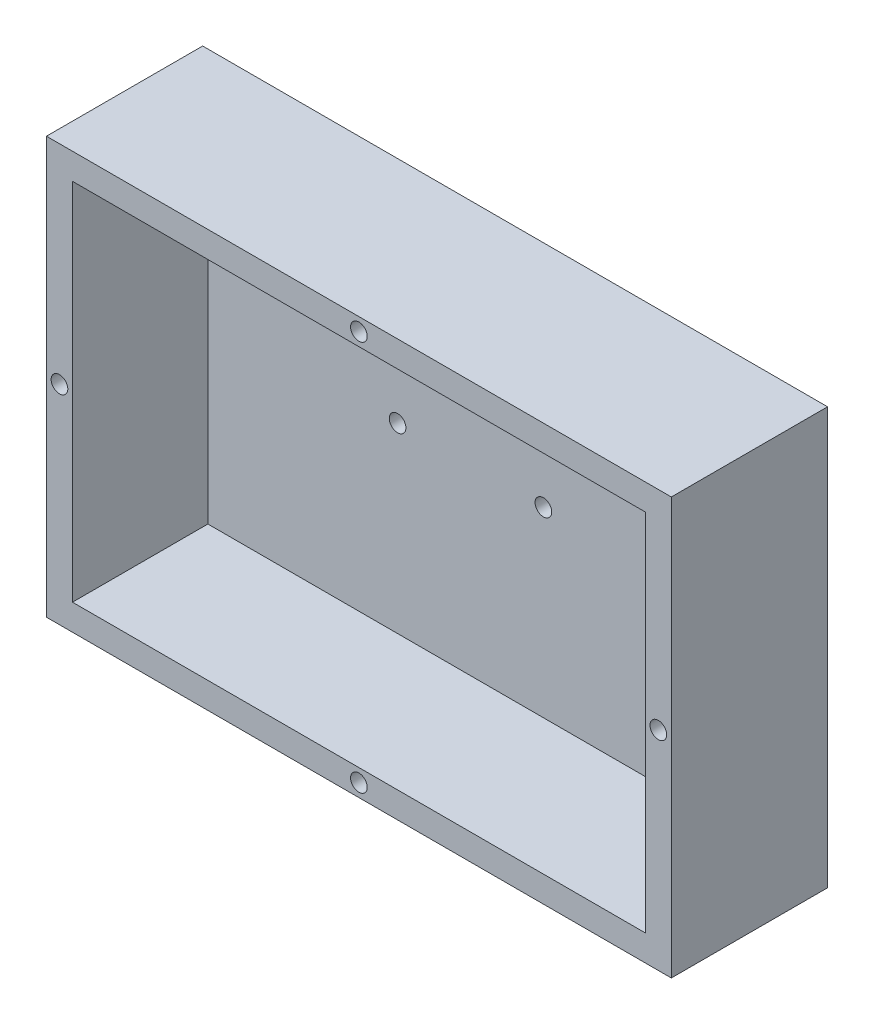
ISO-10303-21;
HEADER;
FILE_DESCRIPTION(('STEP AP214'),'2;1');
FILE_NAME('part.step','',(''),(''),'','','');
FILE_SCHEMA(('AUTOMOTIVE_DESIGN { 1 0 10303 214 1 1 1 1 }'));
ENDSEC;
DATA;
#1=APPLICATION_CONTEXT('core data for automotive mechanical design processes');
#2=APPLICATION_PROTOCOL_DEFINITION('international standard','automotive_design',2000,#1);
#3=PRODUCT_CONTEXT('',#1,'mechanical');
#4=PRODUCT('Part','Part','',(#3));
#5=PRODUCT_RELATED_PRODUCT_CATEGORY('part','',(#4));
#6=PRODUCT_DEFINITION_FORMATION('','',#4);
#7=PRODUCT_DEFINITION_CONTEXT('part definition',#1,'design');
#8=PRODUCT_DEFINITION('design','',#6,#7);
#9=PRODUCT_DEFINITION_SHAPE('','',#8);
#10=(LENGTH_UNIT() NAMED_UNIT(*) SI_UNIT(.MILLI.,.METRE.));
#11=(NAMED_UNIT(*) PLANE_ANGLE_UNIT() SI_UNIT($,.RADIAN.));
#12=(NAMED_UNIT(*) SI_UNIT($,.STERADIAN.) SOLID_ANGLE_UNIT());
#13=UNCERTAINTY_MEASURE_WITH_UNIT(LENGTH_MEASURE(1.E-05),#10,'distance_accuracy_value','');
#14=(GEOMETRIC_REPRESENTATION_CONTEXT(3) GLOBAL_UNCERTAINTY_ASSIGNED_CONTEXT((#13)) GLOBAL_UNIT_ASSIGNED_CONTEXT((#10,
#11,#12)) REPRESENTATION_CONTEXT('',''));
#15=CARTESIAN_POINT('',(0.,0.,0.));
#16=DIRECTION('',(0.,0.,1.));
#17=DIRECTION('',(1.,0.,0.));
#18=AXIS2_PLACEMENT_3D('',#15,#16,#17);
#19=CARTESIAN_POINT('',(0.,0.,19.05));
#20=DIRECTION('',(1.,0.,0.));
#21=DIRECTION('',(0.,0.,-1.));
#22=AXIS2_PLACEMENT_3D('',#19,#20,#21);
#23=PLANE('',#22);
#24=DIRECTION('',(0.,-1.,0.));
#25=VECTOR('',#24,1.);
#26=CARTESIAN_POINT('',(0.,0.,0.));
#27=LINE('',#26,#25);
#28=CARTESIAN_POINT('',(0.,50.8,0.));
#29=VERTEX_POINT('',#28);
#30=CARTESIAN_POINT('',(0.,0.,0.));
#31=VERTEX_POINT('',#30);
#32=EDGE_CURVE('E147',#29,#31,#27,.T.);
#33=ORIENTED_EDGE('',*,*,#32,.T.);
#34=DIRECTION('',(0.,0.,-1.));
#35=VECTOR('',#34,1.);
#36=CARTESIAN_POINT('',(0.,0.,19.05));
#37=LINE('',#36,#35);
#38=CARTESIAN_POINT('',(0.,0.,19.05));
#39=VERTEX_POINT('',#38);
#40=EDGE_CURVE('E11',#39,#31,#37,.T.);
#41=ORIENTED_EDGE('',*,*,#40,.F.);
#42=DIRECTION('',(0.,-1.,0.));
#43=VECTOR('',#42,1.);
#44=CARTESIAN_POINT('',(0.,0.,19.05));
#45=LINE('',#44,#43);
#46=CARTESIAN_POINT('',(0.,50.8,19.05));
#47=VERTEX_POINT('',#46);
#48=EDGE_CURVE('E154',#47,#39,#45,.T.);
#49=ORIENTED_EDGE('',*,*,#48,.F.);
#50=DIRECTION('',(0.,0.,-1.));
#51=VECTOR('',#50,1.);
#52=CARTESIAN_POINT('',(0.,50.8,19.05));
#53=LINE('',#52,#51);
#54=EDGE_CURVE('E157',#47,#29,#53,.T.);
#55=ORIENTED_EDGE('',*,*,#54,.T.);
#56=EDGE_LOOP('',(#33,#41,#49,#55));
#57=FACE_BOUND('',#56,.T.);
#58=ADVANCED_FACE('F39',(#57),#23,.F.);
#59=CARTESIAN_POINT('',(0.,0.,19.05));
#60=DIRECTION('',(0.,1.,0.));
#61=DIRECTION('',(0.,0.,1.));
#62=AXIS2_PLACEMENT_3D('',#59,#60,#61);
#63=PLANE('',#62);
#64=DIRECTION('',(1.,0.,0.));
#65=VECTOR('',#64,1.);
#66=CARTESIAN_POINT('',(0.,0.,0.));
#67=LINE('',#66,#65);
#68=CARTESIAN_POINT('',(76.2,0.,0.));
#69=VERTEX_POINT('',#68);
#70=EDGE_CURVE('E161',#31,#69,#67,.T.);
#71=ORIENTED_EDGE('',*,*,#70,.T.);
#72=DIRECTION('',(0.,0.,-1.));
#73=VECTOR('',#72,1.);
#74=CARTESIAN_POINT('',(76.2,0.,19.05));
#75=LINE('',#74,#73);
#76=CARTESIAN_POINT('',(76.2,0.,19.05));
#77=VERTEX_POINT('',#76);
#78=EDGE_CURVE('E46',#77,#69,#75,.T.);
#79=ORIENTED_EDGE('',*,*,#78,.F.);
#80=DIRECTION('',(1.,0.,0.));
#81=VECTOR('',#80,1.);
#82=CARTESIAN_POINT('',(0.,0.,19.05));
#83=LINE('',#82,#81);
#84=EDGE_CURVE('E86',#39,#77,#83,.T.);
#85=ORIENTED_EDGE('',*,*,#84,.F.);
#86=ORIENTED_EDGE('',*,*,#40,.T.);
#87=EDGE_LOOP('',(#71,#79,#85,#86));
#88=FACE_BOUND('',#87,.T.);
#89=ADVANCED_FACE('F195',(#88),#63,.F.);
#90=CARTESIAN_POINT('',(76.2,0.,19.05));
#91=DIRECTION('',(-1.,0.,0.));
#92=DIRECTION('',(0.,0.,1.));
#93=AXIS2_PLACEMENT_3D('',#90,#91,#92);
#94=PLANE('',#93);
#95=DIRECTION('',(0.,1.,0.));
#96=VECTOR('',#95,1.);
#97=CARTESIAN_POINT('',(76.2,0.,0.));
#98=LINE('',#97,#96);
#99=CARTESIAN_POINT('',(76.2,50.8,0.));
#100=VERTEX_POINT('',#99);
#101=EDGE_CURVE('E164',#69,#100,#98,.T.);
#102=ORIENTED_EDGE('',*,*,#101,.T.);
#103=DIRECTION('',(0.,0.,-1.));
#104=VECTOR('',#103,1.);
#105=CARTESIAN_POINT('',(76.2,50.8,19.05));
#106=LINE('',#105,#104);
#107=CARTESIAN_POINT('',(76.2,50.8,19.05));
#108=VERTEX_POINT('',#107);
#109=EDGE_CURVE('E169',#108,#100,#106,.T.);
#110=ORIENTED_EDGE('',*,*,#109,.F.);
#111=DIRECTION('',(0.,1.,0.));
#112=VECTOR('',#111,1.);
#113=CARTESIAN_POINT('',(76.2,0.,19.05));
#114=LINE('',#113,#112);
#115=EDGE_CURVE('E160',#77,#108,#114,.T.);
#116=ORIENTED_EDGE('',*,*,#115,.F.);
#117=ORIENTED_EDGE('',*,*,#78,.T.);
#118=EDGE_LOOP('',(#102,#110,#116,#117));
#119=FACE_BOUND('',#118,.T.);
#120=ADVANCED_FACE('F172',(#119),#94,.F.);
#121=CARTESIAN_POINT('',(0.,50.8,19.05));
#122=DIRECTION('',(0.,-1.,0.));
#123=DIRECTION('',(0.,0.,-1.));
#124=AXIS2_PLACEMENT_3D('',#121,#122,#123);
#125=PLANE('',#124);
#126=DIRECTION('',(-1.,0.,0.));
#127=VECTOR('',#126,1.);
#128=CARTESIAN_POINT('',(0.,50.8,0.));
#129=LINE('',#128,#127);
#130=EDGE_CURVE('E85',#100,#29,#129,.T.);
#131=ORIENTED_EDGE('',*,*,#130,.T.);
#132=ORIENTED_EDGE('',*,*,#54,.F.);
#133=DIRECTION('',(-1.,0.,0.));
#134=VECTOR('',#133,1.);
#135=CARTESIAN_POINT('',(0.,50.8,19.05));
#136=LINE('',#135,#134);
#137=EDGE_CURVE('E61',#108,#47,#136,.T.);
#138=ORIENTED_EDGE('',*,*,#137,.F.);
#139=ORIENTED_EDGE('',*,*,#109,.T.);
#140=EDGE_LOOP('',(#131,#132,#138,#139));
#141=FACE_BOUND('',#140,.T.);
#142=ADVANCED_FACE('F185',(#141),#125,.F.);
#143=CARTESIAN_POINT('',(0.,0.,19.05));
#144=DIRECTION('',(0.,0.,-1.));
#145=DIRECTION('',(-1.,0.,0.));
#146=AXIS2_PLACEMENT_3D('',#143,#144,#145);
#147=PLANE('',#146);
#148=CARTESIAN_POINT('',(1.58749999999999,25.4,19.05));
#149=DIRECTION('',(0.,0.,1.));
#150=DIRECTION('',(1.,0.,0.));
#151=AXIS2_PLACEMENT_3D('',#148,#149,#150);
#152=CIRCLE('',#151,1.016);
#153=CARTESIAN_POINT('',(2.60349999999999,25.4,19.05));
#154=VERTEX_POINT('',#153);
#155=EDGE_CURVE('E394',#154,#154,#152,.T.);
#156=ORIENTED_EDGE('',*,*,#155,.F.);
#157=EDGE_LOOP('',(#156));
#158=FACE_BOUND('',#157,.T.);
#159=CARTESIAN_POINT('',(38.1,49.2125,19.05));
#160=DIRECTION('',(0.,0.,1.));
#161=DIRECTION('',(1.,0.,0.));
#162=AXIS2_PLACEMENT_3D('',#159,#160,#161);
#163=CIRCLE('',#162,1.016);
#164=CARTESIAN_POINT('',(39.116,49.2125,19.05));
#165=VERTEX_POINT('',#164);
#166=EDGE_CURVE('E400',#165,#165,#163,.T.);
#167=ORIENTED_EDGE('',*,*,#166,.F.);
#168=EDGE_LOOP('',(#167));
#169=FACE_BOUND('',#168,.T.);
#170=CARTESIAN_POINT('',(74.6125,25.4,19.05));
#171=DIRECTION('',(0.,0.,1.));
#172=DIRECTION('',(1.,0.,0.));
#173=AXIS2_PLACEMENT_3D('',#170,#171,#172);
#174=CIRCLE('',#173,1.016);
#175=CARTESIAN_POINT('',(75.6285,25.4,19.05));
#176=VERTEX_POINT('',#175);
#177=EDGE_CURVE('E401',#176,#176,#174,.T.);
#178=ORIENTED_EDGE('',*,*,#177,.F.);
#179=EDGE_LOOP('',(#178));
#180=FACE_BOUND('',#179,.T.);
#181=CARTESIAN_POINT('',(38.1,1.5875,19.05));
#182=DIRECTION('',(0.,0.,1.));
#183=DIRECTION('',(1.,0.,0.));
#184=AXIS2_PLACEMENT_3D('',#181,#182,#183);
#185=CIRCLE('',#184,1.016);
#186=CARTESIAN_POINT('',(39.116,1.5875,19.05));
#187=VERTEX_POINT('',#186);
#188=EDGE_CURVE('E410',#187,#187,#185,.T.);
#189=ORIENTED_EDGE('',*,*,#188,.F.);
#190=EDGE_LOOP('',(#189));
#191=FACE_BOUND('',#190,.T.);
#192=DIRECTION('',(0.,1.,0.));
#193=VECTOR('',#192,1.);
#194=CARTESIAN_POINT('',(73.025,0.,19.05));
#195=LINE('',#194,#193);
#196=CARTESIAN_POINT('',(73.025,3.175,19.05));
#197=VERTEX_POINT('',#196);
#198=CARTESIAN_POINT('',(73.025,47.625,19.05));
#199=VERTEX_POINT('',#198);
#200=EDGE_CURVE('E141',#197,#199,#195,.T.);
#201=ORIENTED_EDGE('',*,*,#200,.F.);
#202=DIRECTION('',(1.,0.,0.));
#203=VECTOR('',#202,1.);
#204=CARTESIAN_POINT('',(0.,3.175,19.05));
#205=LINE('',#204,#203);
#206=CARTESIAN_POINT('',(3.17499999999999,3.175,19.05));
#207=VERTEX_POINT('',#206);
#208=EDGE_CURVE('E52',#207,#197,#205,.T.);
#209=ORIENTED_EDGE('',*,*,#208,.F.);
#210=DIRECTION('',(0.,1.,0.));
#211=VECTOR('',#210,1.);
#212=CARTESIAN_POINT('',(3.17499999999999,0.,19.05));
#213=LINE('',#212,#211);
#214=CARTESIAN_POINT('',(3.17499999999999,47.625,19.05));
#215=VERTEX_POINT('',#214);
#216=EDGE_CURVE('E132',#207,#215,#213,.T.);
#217=ORIENTED_EDGE('',*,*,#216,.T.);
#218=DIRECTION('',(1.,0.,0.));
#219=VECTOR('',#218,1.);
#220=CARTESIAN_POINT('',(0.,47.625,19.05));
#221=LINE('',#220,#219);
#222=EDGE_CURVE('E134',#215,#199,#221,.T.);
#223=ORIENTED_EDGE('',*,*,#222,.T.);
#224=EDGE_LOOP('',(#201,#209,#217,#223));
#225=FACE_BOUND('',#224,.T.);
#226=ORIENTED_EDGE('',*,*,#48,.T.);
#227=ORIENTED_EDGE('',*,*,#84,.T.);
#228=ORIENTED_EDGE('',*,*,#115,.T.);
#229=ORIENTED_EDGE('',*,*,#137,.T.);
#230=EDGE_LOOP('',(#226,#227,#228,#229));
#231=FACE_BOUND('',#230,.T.);
#232=ADVANCED_FACE('F183',(#158,#169,#180,#191,#225,#231),#147,.F.);
#233=CARTESIAN_POINT('',(0.,0.,0.));
#234=DIRECTION('',(0.,0.,-1.));
#235=DIRECTION('',(-1.,0.,0.));
#236=AXIS2_PLACEMENT_3D('',#233,#234,#235);
#237=PLANE('',#236);
#238=CARTESIAN_POINT('',(26.3100238954248,25.4,0.));
#239=DIRECTION('',(0.,0.,1.));
#240=DIRECTION('',(1.,0.,0.));
#241=AXIS2_PLACEMENT_3D('',#238,#239,#240);
#242=CIRCLE('',#241,1.016);
#243=CARTESIAN_POINT('',(27.3260238954248,25.4,0.));
#244=VERTEX_POINT('',#243);
#245=EDGE_CURVE('E378',#244,#244,#242,.T.);
#246=ORIENTED_EDGE('',*,*,#245,.T.);
#247=EDGE_LOOP('',(#246));
#248=FACE_BOUND('',#247,.T.);
#249=CARTESIAN_POINT('',(44.0900238954248,25.4,0.));
#250=DIRECTION('',(0.,0.,1.));
#251=DIRECTION('',(1.,0.,0.));
#252=AXIS2_PLACEMENT_3D('',#249,#250,#251);
#253=CIRCLE('',#252,1.016);
#254=CARTESIAN_POINT('',(45.1060238954248,25.4,0.));
#255=VERTEX_POINT('',#254);
#256=EDGE_CURVE('E386',#255,#255,#253,.T.);
#257=ORIENTED_EDGE('',*,*,#256,.T.);
#258=EDGE_LOOP('',(#257));
#259=FACE_BOUND('',#258,.T.);
#260=ORIENTED_EDGE('',*,*,#32,.F.);
#261=ORIENTED_EDGE('',*,*,#130,.F.);
#262=ORIENTED_EDGE('',*,*,#101,.F.);
#263=ORIENTED_EDGE('',*,*,#70,.F.);
#264=EDGE_LOOP('',(#260,#261,#262,#263));
#265=FACE_BOUND('',#264,.T.);
#266=ADVANCED_FACE('F178',(#248,#259,#265),#237,.T.);
#267=CARTESIAN_POINT('',(0.,3.175,2.54));
#268=DIRECTION('',(0.,-1.,0.));
#269=DIRECTION('',(0.,0.,-1.));
#270=AXIS2_PLACEMENT_3D('',#267,#268,#269);
#271=PLANE('',#270);
#272=ORIENTED_EDGE('',*,*,#208,.T.);
#273=DIRECTION('',(0.,0.,1.));
#274=VECTOR('',#273,1.);
#275=CARTESIAN_POINT('',(73.025,3.175,2.54));
#276=LINE('',#275,#274);
#277=CARTESIAN_POINT('',(73.025,3.175,2.54));
#278=VERTEX_POINT('',#277);
#279=EDGE_CURVE('E109',#278,#197,#276,.T.);
#280=ORIENTED_EDGE('',*,*,#279,.F.);
#281=DIRECTION('',(1.,0.,0.));
#282=VECTOR('',#281,1.);
#283=CARTESIAN_POINT('',(0.,3.175,2.54));
#284=LINE('',#283,#282);
#285=CARTESIAN_POINT('',(3.17499999999999,3.175,2.54));
#286=VERTEX_POINT('',#285);
#287=EDGE_CURVE('E112',#286,#278,#284,.T.);
#288=ORIENTED_EDGE('',*,*,#287,.F.);
#289=DIRECTION('',(0.,0.,1.));
#290=VECTOR('',#289,1.);
#291=CARTESIAN_POINT('',(3.17499999999999,3.175,2.54));
#292=LINE('',#291,#290);
#293=EDGE_CURVE('E150',#286,#207,#292,.T.);
#294=ORIENTED_EDGE('',*,*,#293,.T.);
#295=EDGE_LOOP('',(#272,#280,#288,#294));
#296=FACE_BOUND('',#295,.T.);
#297=ADVANCED_FACE('F115',(#296),#271,.F.);
#298=CARTESIAN_POINT('',(3.17499999999999,0.,2.54));
#299=DIRECTION('',(1.,0.,0.));
#300=DIRECTION('',(0.,0.,-1.));
#301=AXIS2_PLACEMENT_3D('',#298,#299,#300);
#302=PLANE('',#301);
#303=ORIENTED_EDGE('',*,*,#216,.F.);
#304=ORIENTED_EDGE('',*,*,#293,.F.);
#305=DIRECTION('',(0.,1.,0.));
#306=VECTOR('',#305,1.);
#307=CARTESIAN_POINT('',(3.17499999999999,0.,2.54));
#308=LINE('',#307,#306);
#309=CARTESIAN_POINT('',(3.17499999999999,47.625,2.54));
#310=VERTEX_POINT('',#309);
#311=EDGE_CURVE('E118',#286,#310,#308,.T.);
#312=ORIENTED_EDGE('',*,*,#311,.T.);
#313=DIRECTION('',(0.,0.,1.));
#314=VECTOR('',#313,1.);
#315=CARTESIAN_POINT('',(3.17499999999999,47.625,2.54));
#316=LINE('',#315,#314);
#317=EDGE_CURVE('E152',#310,#215,#316,.T.);
#318=ORIENTED_EDGE('',*,*,#317,.T.);
#319=EDGE_LOOP('',(#303,#304,#312,#318));
#320=FACE_BOUND('',#319,.T.);
#321=ADVANCED_FACE('F238',(#320),#302,.T.);
#322=CARTESIAN_POINT('',(0.,47.625,2.54));
#323=DIRECTION('',(0.,-1.,0.));
#324=DIRECTION('',(1.,0.,0.));
#325=AXIS2_PLACEMENT_3D('',#322,#323,#324);
#326=PLANE('',#325);
#327=ORIENTED_EDGE('',*,*,#222,.F.);
#328=ORIENTED_EDGE('',*,*,#317,.F.);
#329=DIRECTION('',(1.,0.,0.));
#330=VECTOR('',#329,1.);
#331=CARTESIAN_POINT('',(0.,47.625,2.54));
#332=LINE('',#331,#330);
#333=CARTESIAN_POINT('',(73.025,47.625,2.54));
#334=VERTEX_POINT('',#333);
#335=EDGE_CURVE('E126',#310,#334,#332,.T.);
#336=ORIENTED_EDGE('',*,*,#335,.T.);
#337=DIRECTION('',(0.,0.,1.));
#338=VECTOR('',#337,1.);
#339=CARTESIAN_POINT('',(73.025,47.625,2.54));
#340=LINE('',#339,#338);
#341=EDGE_CURVE('E117',#334,#199,#340,.T.);
#342=ORIENTED_EDGE('',*,*,#341,.T.);
#343=EDGE_LOOP('',(#327,#328,#336,#342));
#344=FACE_BOUND('',#343,.T.);
#345=ADVANCED_FACE('F250',(#344),#326,.T.);
#346=CARTESIAN_POINT('',(73.025,0.,2.54));
#347=DIRECTION('',(1.,0.,0.));
#348=DIRECTION('',(0.,0.,-1.));
#349=AXIS2_PLACEMENT_3D('',#346,#347,#348);
#350=PLANE('',#349);
#351=ORIENTED_EDGE('',*,*,#200,.T.);
#352=ORIENTED_EDGE('',*,*,#341,.F.);
#353=DIRECTION('',(0.,1.,0.));
#354=VECTOR('',#353,1.);
#355=CARTESIAN_POINT('',(73.025,0.,2.54));
#356=LINE('',#355,#354);
#357=EDGE_CURVE('E124',#278,#334,#356,.T.);
#358=ORIENTED_EDGE('',*,*,#357,.F.);
#359=ORIENTED_EDGE('',*,*,#279,.T.);
#360=EDGE_LOOP('',(#351,#352,#358,#359));
#361=FACE_BOUND('',#360,.T.);
#362=ADVANCED_FACE('F121',(#361),#350,.F.);
#363=CARTESIAN_POINT('',(0.,0.,2.54));
#364=DIRECTION('',(0.,0.,1.));
#365=DIRECTION('',(1.,0.,0.));
#366=AXIS2_PLACEMENT_3D('',#363,#364,#365);
#367=PLANE('',#366);
#368=CARTESIAN_POINT('',(26.3100238954248,25.4,2.54));
#369=DIRECTION('',(0.,0.,1.));
#370=DIRECTION('',(1.,0.,0.));
#371=AXIS2_PLACEMENT_3D('',#368,#369,#370);
#372=CIRCLE('',#371,1.016);
#373=CARTESIAN_POINT('',(27.3260238954248,25.4,2.54));
#374=VERTEX_POINT('',#373);
#375=EDGE_CURVE('E385',#374,#374,#372,.T.);
#376=ORIENTED_EDGE('',*,*,#375,.F.);
#377=EDGE_LOOP('',(#376));
#378=FACE_BOUND('',#377,.T.);
#379=CARTESIAN_POINT('',(44.0900238954248,25.4,2.54));
#380=DIRECTION('',(0.,0.,1.));
#381=DIRECTION('',(1.,0.,0.));
#382=AXIS2_PLACEMENT_3D('',#379,#380,#381);
#383=CIRCLE('',#382,1.016);
#384=CARTESIAN_POINT('',(45.1060238954248,25.4,2.54));
#385=VERTEX_POINT('',#384);
#386=EDGE_CURVE('E384',#385,#385,#383,.T.);
#387=ORIENTED_EDGE('',*,*,#386,.F.);
#388=EDGE_LOOP('',(#387));
#389=FACE_BOUND('',#388,.T.);
#390=ORIENTED_EDGE('',*,*,#287,.T.);
#391=ORIENTED_EDGE('',*,*,#357,.T.);
#392=ORIENTED_EDGE('',*,*,#335,.F.);
#393=ORIENTED_EDGE('',*,*,#311,.F.);
#394=EDGE_LOOP('',(#390,#391,#392,#393));
#395=FACE_BOUND('',#394,.T.);
#396=ADVANCED_FACE('F127',(#378,#389,#395),#367,.T.);
#397=CARTESIAN_POINT('',(38.1,1.5875,13.97));
#398=DIRECTION('',(0.,0.,1.));
#399=DIRECTION('',(1.,0.,0.));
#400=AXIS2_PLACEMENT_3D('',#397,#398,#399);
#401=CYLINDRICAL_SURFACE('',#400,1.016);
#402=CARTESIAN_POINT('',(38.1,1.5875,13.97));
#403=DIRECTION('',(0.,0.,1.));
#404=DIRECTION('',(1.,0.,0.));
#405=AXIS2_PLACEMENT_3D('',#402,#403,#404);
#406=CIRCLE('',#405,1.016);
#407=CARTESIAN_POINT('',(39.116,1.5875,13.97));
#408=VERTEX_POINT('',#407);
#409=EDGE_CURVE('E140',#408,#408,#406,.T.);
#410=ORIENTED_EDGE('',*,*,#409,.F.);
#411=EDGE_LOOP('',(#410));
#412=FACE_BOUND('',#411,.T.);
#413=ORIENTED_EDGE('',*,*,#188,.T.);
#414=EDGE_LOOP('',(#413));
#415=FACE_BOUND('',#414,.T.);
#416=ADVANCED_FACE('F275',(#412,#415),#401,.F.);
#417=CARTESIAN_POINT('',(38.1,1.5875,13.97));
#418=DIRECTION('',(0.,0.,1.));
#419=DIRECTION('',(1.,0.,0.));
#420=AXIS2_PLACEMENT_3D('',#417,#418,#419);
#421=PLANE('',#420);
#422=ORIENTED_EDGE('',*,*,#409,.T.);
#423=EDGE_LOOP('',(#422));
#424=FACE_BOUND('',#423,.T.);
#425=ADVANCED_FACE('F281',(#424),#421,.T.);
#426=CARTESIAN_POINT('',(74.6125,25.4,13.97));
#427=DIRECTION('',(0.,0.,1.));
#428=DIRECTION('',(1.,0.,0.));
#429=AXIS2_PLACEMENT_3D('',#426,#427,#428);
#430=CYLINDRICAL_SURFACE('',#429,1.016);
#431=CARTESIAN_POINT('',(74.6125,25.4,13.97));
#432=DIRECTION('',(0.,0.,1.));
#433=DIRECTION('',(1.,0.,0.));
#434=AXIS2_PLACEMENT_3D('',#431,#432,#433);
#435=CIRCLE('',#434,1.016);
#436=CARTESIAN_POINT('',(75.6285,25.4,13.97));
#437=VERTEX_POINT('',#436);
#438=EDGE_CURVE('E409',#437,#437,#435,.T.);
#439=ORIENTED_EDGE('',*,*,#438,.F.);
#440=EDGE_LOOP('',(#439));
#441=FACE_BOUND('',#440,.T.);
#442=ORIENTED_EDGE('',*,*,#177,.T.);
#443=EDGE_LOOP('',(#442));
#444=FACE_BOUND('',#443,.T.);
#445=ADVANCED_FACE('F294',(#441,#444),#430,.F.);
#446=CARTESIAN_POINT('',(74.6125,25.4,13.97));
#447=DIRECTION('',(0.,0.,1.));
#448=DIRECTION('',(1.,0.,0.));
#449=AXIS2_PLACEMENT_3D('',#446,#447,#448);
#450=PLANE('',#449);
#451=ORIENTED_EDGE('',*,*,#438,.T.);
#452=EDGE_LOOP('',(#451));
#453=FACE_BOUND('',#452,.T.);
#454=ADVANCED_FACE('F304',(#453),#450,.T.);
#455=CARTESIAN_POINT('',(38.1,49.2125,13.97));
#456=DIRECTION('',(0.,0.,1.));
#457=DIRECTION('',(1.,0.,0.));
#458=AXIS2_PLACEMENT_3D('',#455,#456,#457);
#459=CYLINDRICAL_SURFACE('',#458,1.016);
#460=CARTESIAN_POINT('',(38.1,49.2125,13.97));
#461=DIRECTION('',(0.,0.,1.));
#462=DIRECTION('',(1.,0.,0.));
#463=AXIS2_PLACEMENT_3D('',#460,#461,#462);
#464=CIRCLE('',#463,1.016);
#465=CARTESIAN_POINT('',(39.116,49.2125,13.97));
#466=VERTEX_POINT('',#465);
#467=EDGE_CURVE('E397',#466,#466,#464,.T.);
#468=ORIENTED_EDGE('',*,*,#467,.F.);
#469=EDGE_LOOP('',(#468));
#470=FACE_BOUND('',#469,.T.);
#471=ORIENTED_EDGE('',*,*,#166,.T.);
#472=EDGE_LOOP('',(#471));
#473=FACE_BOUND('',#472,.T.);
#474=ADVANCED_FACE('F314',(#470,#473),#459,.F.);
#475=CARTESIAN_POINT('',(38.1,49.2125,13.97));
#476=DIRECTION('',(0.,0.,1.));
#477=DIRECTION('',(1.,0.,0.));
#478=AXIS2_PLACEMENT_3D('',#475,#476,#477);
#479=PLANE('',#478);
#480=ORIENTED_EDGE('',*,*,#467,.T.);
#481=EDGE_LOOP('',(#480));
#482=FACE_BOUND('',#481,.T.);
#483=ADVANCED_FACE('F322',(#482),#479,.T.);
#484=CARTESIAN_POINT('',(1.58749999999999,25.4,13.97));
#485=DIRECTION('',(0.,0.,1.));
#486=DIRECTION('',(1.,0.,0.));
#487=AXIS2_PLACEMENT_3D('',#484,#485,#486);
#488=CYLINDRICAL_SURFACE('',#487,1.016);
#489=CARTESIAN_POINT('',(1.58749999999999,25.4,13.97));
#490=DIRECTION('',(0.,0.,1.));
#491=DIRECTION('',(1.,0.,0.));
#492=AXIS2_PLACEMENT_3D('',#489,#490,#491);
#493=CIRCLE('',#492,1.016);
#494=CARTESIAN_POINT('',(2.60349999999999,25.4,13.97));
#495=VERTEX_POINT('',#494);
#496=EDGE_CURVE('E144',#495,#495,#493,.T.);
#497=ORIENTED_EDGE('',*,*,#496,.F.);
#498=EDGE_LOOP('',(#497));
#499=FACE_BOUND('',#498,.T.);
#500=ORIENTED_EDGE('',*,*,#155,.T.);
#501=EDGE_LOOP('',(#500));
#502=FACE_BOUND('',#501,.T.);
#503=ADVANCED_FACE('F332',(#499,#502),#488,.F.);
#504=CARTESIAN_POINT('',(1.58749999999999,25.4,13.97));
#505=DIRECTION('',(0.,0.,1.));
#506=DIRECTION('',(1.,0.,0.));
#507=AXIS2_PLACEMENT_3D('',#504,#505,#506);
#508=PLANE('',#507);
#509=ORIENTED_EDGE('',*,*,#496,.T.);
#510=EDGE_LOOP('',(#509));
#511=FACE_BOUND('',#510,.T.);
#512=ADVANCED_FACE('F342',(#511),#508,.T.);
#513=CARTESIAN_POINT('',(44.0900238954248,25.4,0.));
#514=DIRECTION('',(0.,0.,1.));
#515=DIRECTION('',(1.,0.,0.));
#516=AXIS2_PLACEMENT_3D('',#513,#514,#515);
#517=CYLINDRICAL_SURFACE('',#516,1.016);
#518=ORIENTED_EDGE('',*,*,#256,.F.);
#519=EDGE_LOOP('',(#518));
#520=FACE_BOUND('',#519,.T.);
#521=ORIENTED_EDGE('',*,*,#386,.T.);
#522=EDGE_LOOP('',(#521));
#523=FACE_BOUND('',#522,.T.);
#524=ADVANCED_FACE('F354',(#520,#523),#517,.F.);
#525=CARTESIAN_POINT('',(26.3100238954248,25.4,0.));
#526=DIRECTION('',(0.,0.,1.));
#527=DIRECTION('',(1.,0.,0.));
#528=AXIS2_PLACEMENT_3D('',#525,#526,#527);
#529=CYLINDRICAL_SURFACE('',#528,1.016);
#530=ORIENTED_EDGE('',*,*,#245,.F.);
#531=EDGE_LOOP('',(#530));
#532=FACE_BOUND('',#531,.T.);
#533=ORIENTED_EDGE('',*,*,#375,.T.);
#534=EDGE_LOOP('',(#533));
#535=FACE_BOUND('',#534,.T.);
#536=ADVANCED_FACE('F361',(#532,#535),#529,.F.);
#537=CLOSED_SHELL('',(#58,#89,#120,#142,#232,#266,#297,#321,#345,#362,#396,#416,#425,#445,#454,
#474,#483,#503,#512,#524,#536));
#538=MANIFOLD_SOLID_BREP('B2',#537);
#539=ADVANCED_BREP_SHAPE_REPRESENTATION('',(#18,#538),#14);
#540=SHAPE_DEFINITION_REPRESENTATION(#9,#539);
ENDSEC;
END-ISO-10303-21;
